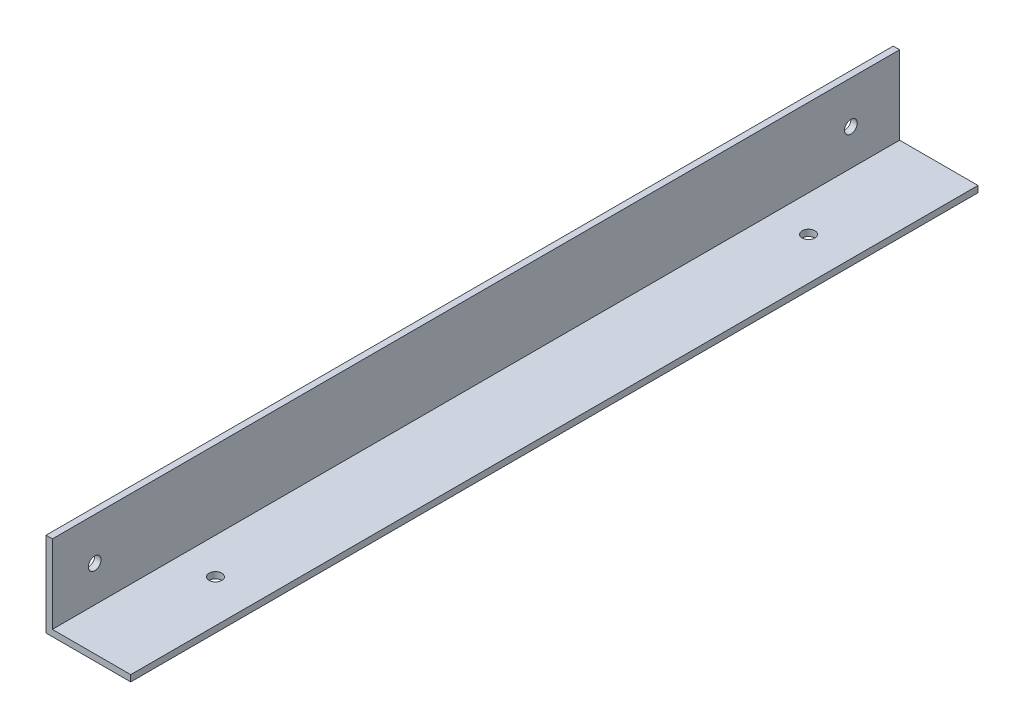
ISO-10303-21;
HEADER;
FILE_DESCRIPTION(('STEP AP214'),'2;1');
FILE_NAME('part.step','',(''),(''),'','','');
FILE_SCHEMA(('AUTOMOTIVE_DESIGN { 1 0 10303 214 1 1 1 1 }'));
ENDSEC;
DATA;
#1=APPLICATION_CONTEXT('core data for automotive mechanical design processes');
#2=APPLICATION_PROTOCOL_DEFINITION('international standard','automotive_design',2000,#1);
#3=PRODUCT_CONTEXT('',#1,'mechanical');
#4=PRODUCT('Part','Part','',(#3));
#5=PRODUCT_RELATED_PRODUCT_CATEGORY('part','',(#4));
#6=PRODUCT_DEFINITION_FORMATION('','',#4);
#7=PRODUCT_DEFINITION_CONTEXT('part definition',#1,'design');
#8=PRODUCT_DEFINITION('design','',#6,#7);
#9=PRODUCT_DEFINITION_SHAPE('','',#8);
#10=(LENGTH_UNIT() NAMED_UNIT(*) SI_UNIT(.MILLI.,.METRE.));
#11=(NAMED_UNIT(*) PLANE_ANGLE_UNIT() SI_UNIT($,.RADIAN.));
#12=(NAMED_UNIT(*) SI_UNIT($,.STERADIAN.) SOLID_ANGLE_UNIT());
#13=UNCERTAINTY_MEASURE_WITH_UNIT(LENGTH_MEASURE(1.E-05),#10,'distance_accuracy_value','');
#14=(GEOMETRIC_REPRESENTATION_CONTEXT(3) GLOBAL_UNCERTAINTY_ASSIGNED_CONTEXT((#13)) GLOBAL_UNIT_ASSIGNED_CONTEXT((#10,
#11,#12)) REPRESENTATION_CONTEXT('',''));
#15=CARTESIAN_POINT('',(0.,0.,0.));
#16=DIRECTION('',(0.,0.,1.));
#17=DIRECTION('',(1.,0.,0.));
#18=AXIS2_PLACEMENT_3D('',#15,#16,#17);
#19=CARTESIAN_POINT('',(-16.61347585352,1.81894736842104,200.));
#20=DIRECTION('',(0.,-1.,0.));
#21=DIRECTION('',(1.,0.,0.));
#22=AXIS2_PLACEMENT_3D('',#19,#20,#21);
#23=PLANE('',#22);
#24=DIRECTION('',(-1.,0.,0.));
#25=VECTOR('',#24,1.);
#26=CARTESIAN_POINT('',(-16.61347585352,1.81894736842104,0.));
#27=LINE('',#26,#25);
#28=CARTESIAN_POINT('',(-16.61347585352,1.81894736842104,0.));
#29=VERTEX_POINT('',#28);
#30=CARTESIAN_POINT('',(-18.11347585352,1.81894736842104,0.));
#31=VERTEX_POINT('',#30);
#32=EDGE_CURVE('E115',#29,#31,#27,.T.);
#33=ORIENTED_EDGE('',*,*,#32,.T.);
#34=DIRECTION('',(0.,0.,-1.));
#35=VECTOR('',#34,1.);
#36=CARTESIAN_POINT('',(-18.11347585352,1.81894736842104,200.));
#37=LINE('',#36,#35);
#38=CARTESIAN_POINT('',(-18.11347585352,1.81894736842104,200.));
#39=VERTEX_POINT('',#38);
#40=EDGE_CURVE('E11',#39,#31,#37,.T.);
#41=ORIENTED_EDGE('',*,*,#40,.F.);
#42=DIRECTION('',(-1.,0.,0.));
#43=VECTOR('',#42,1.);
#44=CARTESIAN_POINT('',(-16.61347585352,1.81894736842104,200.));
#45=LINE('',#44,#43);
#46=CARTESIAN_POINT('',(-16.61347585352,1.81894736842104,200.));
#47=VERTEX_POINT('',#46);
#48=EDGE_CURVE('E126',#47,#39,#45,.T.);
#49=ORIENTED_EDGE('',*,*,#48,.F.);
#50=DIRECTION('',(0.,0.,-1.));
#51=VECTOR('',#50,1.);
#52=CARTESIAN_POINT('',(-16.61347585352,1.81894736842104,200.));
#53=LINE('',#52,#51);
#54=EDGE_CURVE('E111',#47,#29,#53,.T.);
#55=ORIENTED_EDGE('',*,*,#54,.T.);
#56=EDGE_LOOP('',(#33,#41,#49,#55));
#57=FACE_BOUND('',#56,.T.);
#58=ADVANCED_FACE('F31',(#57),#23,.F.);
#59=CARTESIAN_POINT('',(-18.11347585352,1.81894736842104,200.));
#60=DIRECTION('',(1.,0.,0.));
#61=DIRECTION('',(0.,1.,0.));
#62=AXIS2_PLACEMENT_3D('',#59,#60,#61);
#63=PLANE('',#62);
#64=CARTESIAN_POINT('',(-18.11347585352,-8.18105263157896,190.));
#65=DIRECTION('',(1.,0.,0.));
#66=DIRECTION('',(0.,1.,0.));
#67=AXIS2_PLACEMENT_3D('',#64,#65,#66);
#68=CIRCLE('',#67,1.5);
#69=CARTESIAN_POINT('',(-18.11347585352,-6.68105263157897,190.));
#70=VERTEX_POINT('',#69);
#71=EDGE_CURVE('E260',#70,#70,#68,.T.);
#72=ORIENTED_EDGE('',*,*,#71,.T.);
#73=EDGE_LOOP('',(#72));
#74=FACE_BOUND('',#73,.T.);
#75=CARTESIAN_POINT('',(-18.11347585352,-8.18105263157896,11.5));
#76=DIRECTION('',(1.,0.,0.));
#77=DIRECTION('',(0.,1.,0.));
#78=AXIS2_PLACEMENT_3D('',#75,#76,#77);
#79=CIRCLE('',#78,1.5);
#80=CARTESIAN_POINT('',(-18.11347585352,-6.68105263157897,11.5));
#81=VERTEX_POINT('',#80);
#82=EDGE_CURVE('E119',#81,#81,#79,.T.);
#83=ORIENTED_EDGE('',*,*,#82,.T.);
#84=EDGE_LOOP('',(#83));
#85=FACE_BOUND('',#84,.T.);
#86=DIRECTION('',(0.,-1.,0.));
#87=VECTOR('',#86,1.);
#88=CARTESIAN_POINT('',(-18.11347585352,1.81894736842104,0.));
#89=LINE('',#88,#87);
#90=CARTESIAN_POINT('',(-18.11347585352,-18.181052631579,0.));
#91=VERTEX_POINT('',#90);
#92=EDGE_CURVE('E118',#31,#91,#89,.T.);
#93=ORIENTED_EDGE('',*,*,#92,.T.);
#94=DIRECTION('',(0.,0.,-1.));
#95=VECTOR('',#94,1.);
#96=CARTESIAN_POINT('',(-18.11347585352,-18.181052631579,200.));
#97=LINE('',#96,#95);
#98=CARTESIAN_POINT('',(-18.11347585352,-18.181052631579,200.));
#99=VERTEX_POINT('',#98);
#100=EDGE_CURVE('E39',#99,#91,#97,.T.);
#101=ORIENTED_EDGE('',*,*,#100,.F.);
#102=DIRECTION('',(0.,-1.,0.));
#103=VECTOR('',#102,1.);
#104=CARTESIAN_POINT('',(-18.11347585352,1.81894736842104,200.));
#105=LINE('',#104,#103);
#106=EDGE_CURVE('E84',#39,#99,#105,.T.);
#107=ORIENTED_EDGE('',*,*,#106,.F.);
#108=ORIENTED_EDGE('',*,*,#40,.T.);
#109=EDGE_LOOP('',(#93,#101,#107,#108));
#110=FACE_BOUND('',#109,.T.);
#111=ADVANCED_FACE('F154',(#74,#85,#110),#63,.F.);
#112=CARTESIAN_POINT('',(-18.11347585352,-18.181052631579,200.));
#113=DIRECTION('',(0.,1.,0.));
#114=DIRECTION('',(0.,0.,1.));
#115=AXIS2_PLACEMENT_3D('',#112,#113,#114);
#116=PLANE('',#115);
#117=CARTESIAN_POINT('',(-8.11347585351996,-18.181052631579,30.));
#118=DIRECTION('',(0.,1.,0.));
#119=DIRECTION('',(0.,0.,1.));
#120=AXIS2_PLACEMENT_3D('',#117,#118,#119);
#121=CIRCLE('',#120,1.5);
#122=CARTESIAN_POINT('',(-8.11347585351996,-18.181052631579,31.5));
#123=VERTEX_POINT('',#122);
#124=EDGE_CURVE('E275',#123,#123,#121,.T.);
#125=ORIENTED_EDGE('',*,*,#124,.T.);
#126=EDGE_LOOP('',(#125));
#127=FACE_BOUND('',#126,.T.);
#128=CARTESIAN_POINT('',(-8.11347585351996,-18.181052631579,170.));
#129=DIRECTION('',(0.,1.,0.));
#130=DIRECTION('',(0.,0.,1.));
#131=AXIS2_PLACEMENT_3D('',#128,#129,#130);
#132=CIRCLE('',#131,1.5);
#133=CARTESIAN_POINT('',(-8.11347585351996,-18.181052631579,171.5));
#134=VERTEX_POINT('',#133);
#135=EDGE_CURVE('E269',#134,#134,#132,.T.);
#136=ORIENTED_EDGE('',*,*,#135,.T.);
#137=EDGE_LOOP('',(#136));
#138=FACE_BOUND('',#137,.T.);
#139=DIRECTION('',(1.,0.,0.));
#140=VECTOR('',#139,1.);
#141=CARTESIAN_POINT('',(-18.11347585352,-18.181052631579,0.));
#142=LINE('',#141,#140);
#143=CARTESIAN_POINT('',(1.88652414648004,-18.181052631579,0.));
#144=VERTEX_POINT('',#143);
#145=EDGE_CURVE('E121',#91,#144,#142,.T.);
#146=ORIENTED_EDGE('',*,*,#145,.T.);
#147=DIRECTION('',(0.,0.,-1.));
#148=VECTOR('',#147,1.);
#149=CARTESIAN_POINT('',(1.88652414648004,-18.181052631579,200.));
#150=LINE('',#149,#148);
#151=CARTESIAN_POINT('',(1.88652414648004,-18.181052631579,200.));
#152=VERTEX_POINT('',#151);
#153=EDGE_CURVE('E106',#152,#144,#150,.T.);
#154=ORIENTED_EDGE('',*,*,#153,.F.);
#155=DIRECTION('',(1.,0.,0.));
#156=VECTOR('',#155,1.);
#157=CARTESIAN_POINT('',(-18.11347585352,-18.181052631579,200.));
#158=LINE('',#157,#156);
#159=EDGE_CURVE('E97',#99,#152,#158,.T.);
#160=ORIENTED_EDGE('',*,*,#159,.F.);
#161=ORIENTED_EDGE('',*,*,#100,.T.);
#162=EDGE_LOOP('',(#146,#154,#160,#161));
#163=FACE_BOUND('',#162,.T.);
#164=ADVANCED_FACE('F132',(#127,#138,#163),#116,.F.);
#165=CARTESIAN_POINT('',(1.88652414648004,-18.181052631579,200.));
#166=DIRECTION('',(-1.,0.,0.));
#167=DIRECTION('',(0.,0.,1.));
#168=AXIS2_PLACEMENT_3D('',#165,#166,#167);
#169=PLANE('',#168);
#170=DIRECTION('',(0.,1.,0.));
#171=VECTOR('',#170,1.);
#172=CARTESIAN_POINT('',(1.88652414648004,-18.181052631579,0.));
#173=LINE('',#172,#171);
#174=CARTESIAN_POINT('',(1.88652414648004,-16.681052631579,0.));
#175=VERTEX_POINT('',#174);
#176=EDGE_CURVE('E105',#144,#175,#173,.T.);
#177=ORIENTED_EDGE('',*,*,#176,.T.);
#178=DIRECTION('',(0.,0.,-1.));
#179=VECTOR('',#178,1.);
#180=CARTESIAN_POINT('',(1.88652414648004,-16.681052631579,200.));
#181=LINE('',#180,#179);
#182=CARTESIAN_POINT('',(1.88652414648004,-16.681052631579,200.));
#183=VERTEX_POINT('',#182);
#184=EDGE_CURVE('E102',#183,#175,#181,.T.);
#185=ORIENTED_EDGE('',*,*,#184,.F.);
#186=DIRECTION('',(0.,1.,0.));
#187=VECTOR('',#186,1.);
#188=CARTESIAN_POINT('',(1.88652414648004,-18.181052631579,200.));
#189=LINE('',#188,#187);
#190=EDGE_CURVE('E91',#152,#183,#189,.T.);
#191=ORIENTED_EDGE('',*,*,#190,.F.);
#192=ORIENTED_EDGE('',*,*,#153,.T.);
#193=EDGE_LOOP('',(#177,#185,#191,#192));
#194=FACE_BOUND('',#193,.T.);
#195=ADVANCED_FACE('F103',(#194),#169,.F.);
#196=CARTESIAN_POINT('',(1.88652414648004,-16.681052631579,200.));
#197=DIRECTION('',(0.,-1.,0.));
#198=DIRECTION('',(1.,0.,0.));
#199=AXIS2_PLACEMENT_3D('',#196,#197,#198);
#200=PLANE('',#199);
#201=CARTESIAN_POINT('',(-8.11347585351996,-16.681052631579,30.));
#202=DIRECTION('',(0.,1.,0.));
#203=DIRECTION('',(-1.,0.,0.));
#204=AXIS2_PLACEMENT_3D('',#201,#202,#203);
#205=CIRCLE('',#204,1.5);
#206=CARTESIAN_POINT('',(-9.61347585351996,-16.681052631579,30.));
#207=VERTEX_POINT('',#206);
#208=EDGE_CURVE('E278',#207,#207,#205,.T.);
#209=ORIENTED_EDGE('',*,*,#208,.F.);
#210=EDGE_LOOP('',(#209));
#211=FACE_BOUND('',#210,.T.);
#212=CARTESIAN_POINT('',(-8.11347585351996,-16.681052631579,170.));
#213=DIRECTION('',(0.,1.,0.));
#214=DIRECTION('',(-1.,0.,0.));
#215=AXIS2_PLACEMENT_3D('',#212,#213,#214);
#216=CIRCLE('',#215,1.5);
#217=CARTESIAN_POINT('',(-9.61347585351997,-16.681052631579,170.));
#218=VERTEX_POINT('',#217);
#219=EDGE_CURVE('E272',#218,#218,#216,.T.);
#220=ORIENTED_EDGE('',*,*,#219,.F.);
#221=EDGE_LOOP('',(#220));
#222=FACE_BOUND('',#221,.T.);
#223=DIRECTION('',(-1.,0.,0.));
#224=VECTOR('',#223,1.);
#225=CARTESIAN_POINT('',(1.88652414648004,-16.681052631579,0.));
#226=LINE('',#225,#224);
#227=CARTESIAN_POINT('',(-16.61347585352,-16.681052631579,0.));
#228=VERTEX_POINT('',#227);
#229=EDGE_CURVE('E70',#175,#228,#226,.T.);
#230=ORIENTED_EDGE('',*,*,#229,.T.);
#231=DIRECTION('',(0.,0.,-1.));
#232=VECTOR('',#231,1.);
#233=CARTESIAN_POINT('',(-16.61347585352,-16.681052631579,200.));
#234=LINE('',#233,#232);
#235=CARTESIAN_POINT('',(-16.61347585352,-16.681052631579,200.));
#236=VERTEX_POINT('',#235);
#237=EDGE_CURVE('E107',#236,#228,#234,.T.);
#238=ORIENTED_EDGE('',*,*,#237,.F.);
#239=DIRECTION('',(-1.,0.,0.));
#240=VECTOR('',#239,1.);
#241=CARTESIAN_POINT('',(1.88652414648004,-16.681052631579,200.));
#242=LINE('',#241,#240);
#243=EDGE_CURVE('E95',#183,#236,#242,.T.);
#244=ORIENTED_EDGE('',*,*,#243,.F.);
#245=ORIENTED_EDGE('',*,*,#184,.T.);
#246=EDGE_LOOP('',(#230,#238,#244,#245));
#247=FACE_BOUND('',#246,.T.);
#248=ADVANCED_FACE('F109',(#211,#222,#247),#200,.F.);
#249=CARTESIAN_POINT('',(-16.61347585352,-16.681052631579,200.));
#250=DIRECTION('',(-1.,0.,0.));
#251=DIRECTION('',(0.,0.,1.));
#252=AXIS2_PLACEMENT_3D('',#249,#250,#251);
#253=PLANE('',#252);
#254=CARTESIAN_POINT('',(-16.61347585352,-8.18105263157896,190.));
#255=DIRECTION('',(1.,0.,0.));
#256=DIRECTION('',(0.,0.,-1.));
#257=AXIS2_PLACEMENT_3D('',#254,#255,#256);
#258=CIRCLE('',#257,1.5);
#259=CARTESIAN_POINT('',(-16.61347585352,-8.18105263157896,188.5));
#260=VERTEX_POINT('',#259);
#261=EDGE_CURVE('E266',#260,#260,#258,.T.);
#262=ORIENTED_EDGE('',*,*,#261,.F.);
#263=EDGE_LOOP('',(#262));
#264=FACE_BOUND('',#263,.T.);
#265=CARTESIAN_POINT('',(-16.61347585352,-8.18105263157896,11.5));
#266=DIRECTION('',(1.,0.,0.));
#267=DIRECTION('',(0.,0.,-1.));
#268=AXIS2_PLACEMENT_3D('',#265,#266,#267);
#269=CIRCLE('',#268,1.5);
#270=CARTESIAN_POINT('',(-16.61347585352,-8.18105263157896,10.));
#271=VERTEX_POINT('',#270);
#272=EDGE_CURVE('E256',#271,#271,#269,.T.);
#273=ORIENTED_EDGE('',*,*,#272,.F.);
#274=EDGE_LOOP('',(#273));
#275=FACE_BOUND('',#274,.T.);
#276=DIRECTION('',(0.,1.,0.));
#277=VECTOR('',#276,1.);
#278=CARTESIAN_POINT('',(-16.61347585352,-16.681052631579,0.));
#279=LINE('',#278,#277);
#280=EDGE_CURVE('E76',#228,#29,#279,.T.);
#281=ORIENTED_EDGE('',*,*,#280,.T.);
#282=ORIENTED_EDGE('',*,*,#54,.F.);
#283=DIRECTION('',(0.,1.,0.));
#284=VECTOR('',#283,1.);
#285=CARTESIAN_POINT('',(-16.61347585352,-16.681052631579,200.));
#286=LINE('',#285,#284);
#287=EDGE_CURVE('E47',#236,#47,#286,.T.);
#288=ORIENTED_EDGE('',*,*,#287,.F.);
#289=ORIENTED_EDGE('',*,*,#237,.T.);
#290=EDGE_LOOP('',(#281,#282,#288,#289));
#291=FACE_BOUND('',#290,.T.);
#292=ADVANCED_FACE('F139',(#264,#275,#291),#253,.F.);
#293=CARTESIAN_POINT('',(-18.11347585352,1.81894736842104,200.));
#294=DIRECTION('',(0.,0.,1.));
#295=DIRECTION('',(1.,0.,0.));
#296=AXIS2_PLACEMENT_3D('',#293,#294,#295);
#297=PLANE('',#296);
#298=ORIENTED_EDGE('',*,*,#48,.T.);
#299=ORIENTED_EDGE('',*,*,#106,.T.);
#300=ORIENTED_EDGE('',*,*,#159,.T.);
#301=ORIENTED_EDGE('',*,*,#190,.T.);
#302=ORIENTED_EDGE('',*,*,#243,.T.);
#303=ORIENTED_EDGE('',*,*,#287,.T.);
#304=EDGE_LOOP('',(#298,#299,#300,#301,#302,#303));
#305=FACE_BOUND('',#304,.T.);
#306=ADVANCED_FACE('F93',(#305),#297,.T.);
#307=CARTESIAN_POINT('',(-18.11347585352,1.81894736842104,0.));
#308=DIRECTION('',(0.,0.,1.));
#309=DIRECTION('',(1.,0.,0.));
#310=AXIS2_PLACEMENT_3D('',#307,#308,#309);
#311=PLANE('',#310);
#312=ORIENTED_EDGE('',*,*,#32,.F.);
#313=ORIENTED_EDGE('',*,*,#280,.F.);
#314=ORIENTED_EDGE('',*,*,#229,.F.);
#315=ORIENTED_EDGE('',*,*,#176,.F.);
#316=ORIENTED_EDGE('',*,*,#145,.F.);
#317=ORIENTED_EDGE('',*,*,#92,.F.);
#318=EDGE_LOOP('',(#312,#313,#314,#315,#316,#317));
#319=FACE_BOUND('',#318,.T.);
#320=ADVANCED_FACE('F135',(#319),#311,.F.);
#321=CARTESIAN_POINT('',(-166.61347585352,-8.18105263157896,11.5));
#322=DIRECTION('',(1.,0.,0.));
#323=DIRECTION('',(0.,0.,-1.));
#324=AXIS2_PLACEMENT_3D('',#321,#322,#323);
#325=CYLINDRICAL_SURFACE('',#324,1.5);
#326=ORIENTED_EDGE('',*,*,#272,.T.);
#327=EDGE_LOOP('',(#326));
#328=FACE_BOUND('',#327,.T.);
#329=ORIENTED_EDGE('',*,*,#82,.F.);
#330=EDGE_LOOP('',(#329));
#331=FACE_BOUND('',#330,.T.);
#332=ADVANCED_FACE('F212',(#328,#331),#325,.F.);
#333=CARTESIAN_POINT('',(-166.61347585352,-8.18105263157896,190.));
#334=DIRECTION('',(1.,0.,0.));
#335=DIRECTION('',(0.,0.,-1.));
#336=AXIS2_PLACEMENT_3D('',#333,#334,#335);
#337=CYLINDRICAL_SURFACE('',#336,1.5);
#338=ORIENTED_EDGE('',*,*,#261,.T.);
#339=EDGE_LOOP('',(#338));
#340=FACE_BOUND('',#339,.T.);
#341=ORIENTED_EDGE('',*,*,#71,.F.);
#342=EDGE_LOOP('',(#341));
#343=FACE_BOUND('',#342,.T.);
#344=ADVANCED_FACE('F192',(#340,#343),#337,.F.);
#345=CARTESIAN_POINT('',(-8.11347585351992,-116.681052631579,170.));
#346=DIRECTION('',(0.,1.,0.));
#347=DIRECTION('',(-1.,0.,0.));
#348=AXIS2_PLACEMENT_3D('',#345,#346,#347);
#349=CYLINDRICAL_SURFACE('',#348,1.5);
#350=ORIENTED_EDGE('',*,*,#219,.T.);
#351=EDGE_LOOP('',(#350));
#352=FACE_BOUND('',#351,.T.);
#353=ORIENTED_EDGE('',*,*,#135,.F.);
#354=EDGE_LOOP('',(#353));
#355=FACE_BOUND('',#354,.T.);
#356=ADVANCED_FACE('F186',(#352,#355),#349,.F.);
#357=CARTESIAN_POINT('',(-8.11347585351992,-116.681052631579,30.));
#358=DIRECTION('',(0.,1.,0.));
#359=DIRECTION('',(-1.,0.,0.));
#360=AXIS2_PLACEMENT_3D('',#357,#358,#359);
#361=CYLINDRICAL_SURFACE('',#360,1.5);
#362=ORIENTED_EDGE('',*,*,#208,.T.);
#363=EDGE_LOOP('',(#362));
#364=FACE_BOUND('',#363,.T.);
#365=ORIENTED_EDGE('',*,*,#124,.F.);
#366=EDGE_LOOP('',(#365));
#367=FACE_BOUND('',#366,.T.);
#368=ADVANCED_FACE('F191',(#364,#367),#361,.F.);
#369=CLOSED_SHELL('',(#58,#111,#164,#195,#248,#292,#306,#320,#332,#344,#356,#368));
#370=MANIFOLD_SOLID_BREP('B2',#369);
#371=ADVANCED_BREP_SHAPE_REPRESENTATION('',(#18,#370),#14);
#372=SHAPE_DEFINITION_REPRESENTATION(#9,#371);
ENDSEC;
END-ISO-10303-21;
